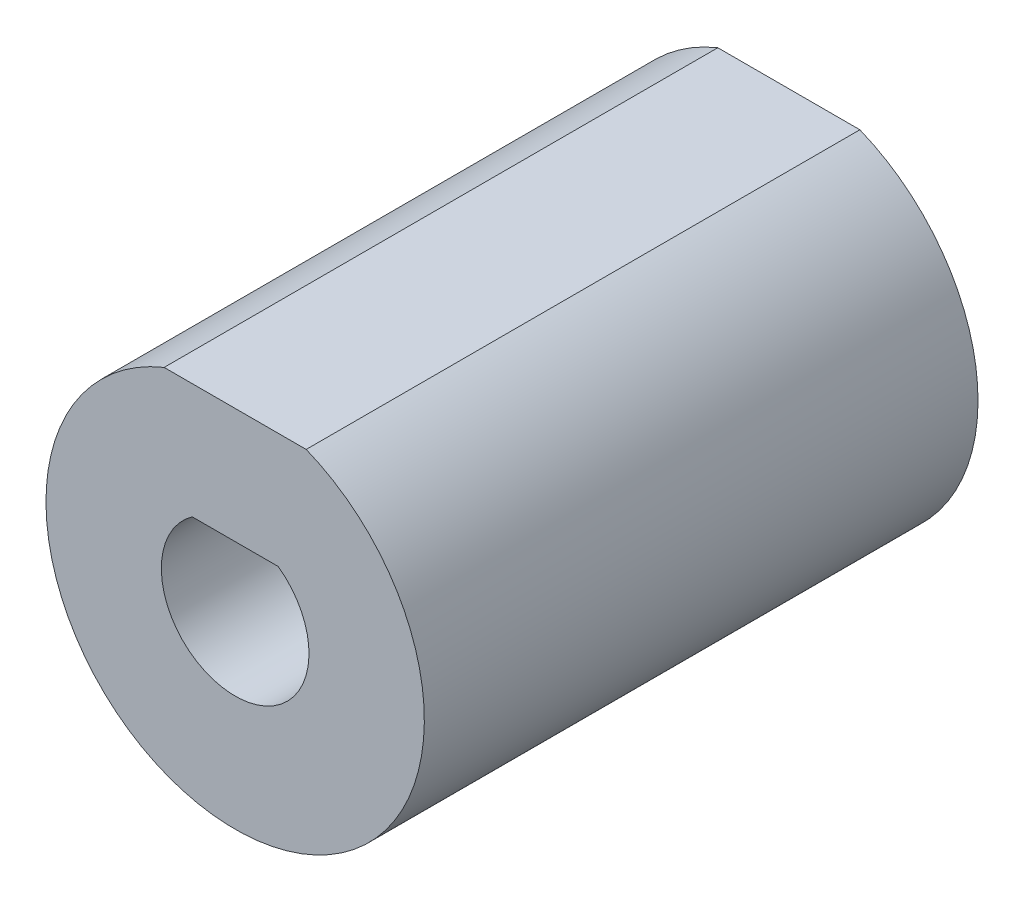
ISO-10303-21;
HEADER;
FILE_DESCRIPTION(('STEP AP214'),'2;1');
FILE_NAME('part.step','',(''),(''),'','','');
FILE_SCHEMA(('AUTOMOTIVE_DESIGN { 1 0 10303 214 1 1 1 1 }'));
ENDSEC;
DATA;
#1=APPLICATION_CONTEXT('core data for automotive mechanical design processes');
#2=APPLICATION_PROTOCOL_DEFINITION('international standard','automotive_design',2000,#1);
#3=PRODUCT_CONTEXT('',#1,'mechanical');
#4=PRODUCT('Part','Part','',(#3));
#5=PRODUCT_RELATED_PRODUCT_CATEGORY('part','',(#4));
#6=PRODUCT_DEFINITION_FORMATION('','',#4);
#7=PRODUCT_DEFINITION_CONTEXT('part definition',#1,'design');
#8=PRODUCT_DEFINITION('design','',#6,#7);
#9=PRODUCT_DEFINITION_SHAPE('','',#8);
#10=(LENGTH_UNIT() NAMED_UNIT(*) SI_UNIT(.MILLI.,.METRE.));
#11=(NAMED_UNIT(*) PLANE_ANGLE_UNIT() SI_UNIT($,.RADIAN.));
#12=(NAMED_UNIT(*) SI_UNIT($,.STERADIAN.) SOLID_ANGLE_UNIT());
#13=UNCERTAINTY_MEASURE_WITH_UNIT(LENGTH_MEASURE(1.E-05),#10,'distance_accuracy_value','');
#14=(GEOMETRIC_REPRESENTATION_CONTEXT(3) GLOBAL_UNCERTAINTY_ASSIGNED_CONTEXT((#13)) GLOBAL_UNIT_ASSIGNED_CONTEXT((#10,
#11,#12)) REPRESENTATION_CONTEXT('',''));
#15=CARTESIAN_POINT('',(0.,0.,0.));
#16=DIRECTION('',(0.,0.,1.));
#17=DIRECTION('',(1.,0.,0.));
#18=AXIS2_PLACEMENT_3D('',#15,#16,#17);
#19=CARTESIAN_POINT('',(0.,0.,6.35));
#20=DIRECTION('',(0.,0.,1.));
#21=DIRECTION('',(1.,0.,0.));
#22=AXIS2_PLACEMENT_3D('',#19,#20,#21);
#23=PLANE('',#22);
#24=CARTESIAN_POINT('',(0.,0.,6.35));
#25=DIRECTION('',(0.,0.,1.));
#26=DIRECTION('',(1.,0.,0.));
#27=AXIS2_PLACEMENT_3D('',#24,#25,#26);
#28=CIRCLE('',#27,5.207);
#29=CARTESIAN_POINT('',(-1.95514014842926,4.826,6.35));
#30=VERTEX_POINT('',#29);
#31=CARTESIAN_POINT('',(1.95514014842926,4.826,6.35));
#32=VERTEX_POINT('',#31);
#33=EDGE_CURVE('E79',#30,#32,#28,.T.);
#34=ORIENTED_EDGE('',*,*,#33,.T.);
#35=DIRECTION('',(-1.,0.,0.));
#36=VECTOR('',#35,1.);
#37=CARTESIAN_POINT('',(-1.95514014842926,4.826,6.35));
#38=LINE('',#37,#36);
#39=EDGE_CURVE('E55',#32,#30,#38,.T.);
#40=ORIENTED_EDGE('',*,*,#39,.T.);
#41=EDGE_LOOP('',(#34,#40));
#42=FACE_BOUND('',#41,.T.);
#43=DIRECTION('',(-1.,0.,0.));
#44=VECTOR('',#43,1.);
#45=CARTESIAN_POINT('',(-1.18457713974228,1.651,6.35));
#46=LINE('',#45,#44);
#47=CARTESIAN_POINT('',(1.18457713974228,1.651,6.35));
#48=VERTEX_POINT('',#47);
#49=CARTESIAN_POINT('',(-1.18457713974228,1.651,6.35));
#50=VERTEX_POINT('',#49);
#51=EDGE_CURVE('E97',#48,#50,#46,.T.);
#52=ORIENTED_EDGE('',*,*,#51,.F.);
#53=CARTESIAN_POINT('',(0.,0.,6.35));
#54=DIRECTION('',(0.,0.,1.));
#55=DIRECTION('',(1.,0.,0.));
#56=AXIS2_PLACEMENT_3D('',#53,#54,#55);
#57=CIRCLE('',#56,2.032);
#58=EDGE_CURVE('E95',#50,#48,#57,.T.);
#59=ORIENTED_EDGE('',*,*,#58,.F.);
#60=EDGE_LOOP('',(#52,#59));
#61=FACE_BOUND('',#60,.T.);
#62=ADVANCED_FACE('F33',(#42,#61),#23,.T.);
#63=CARTESIAN_POINT('',(0.,0.,6.35));
#64=DIRECTION('',(0.,0.,-1.));
#65=DIRECTION('',(-1.,0.,0.));
#66=AXIS2_PLACEMENT_3D('',#63,#64,#65);
#67=CYLINDRICAL_SURFACE('',#66,5.207);
#68=DIRECTION('',(0.,0.,-1.));
#69=VECTOR('',#68,1.);
#70=CARTESIAN_POINT('',(-1.95514014842926,4.826,6.35));
#71=LINE('',#70,#69);
#72=CARTESIAN_POINT('',(-1.95514014842926,4.826,-8.89));
#73=VERTEX_POINT('',#72);
#74=EDGE_CURVE('E74',#30,#73,#71,.T.);
#75=ORIENTED_EDGE('',*,*,#74,.T.);
#76=CARTESIAN_POINT('',(0.,0.,-8.89));
#77=DIRECTION('',(0.,0.,-1.));
#78=DIRECTION('',(-1.,0.,0.));
#79=AXIS2_PLACEMENT_3D('',#76,#77,#78);
#80=CIRCLE('',#79,5.207);
#81=CARTESIAN_POINT('',(1.95514014842926,4.826,-8.89));
#82=VERTEX_POINT('',#81);
#83=EDGE_CURVE('E78',#82,#73,#80,.T.);
#84=ORIENTED_EDGE('',*,*,#83,.F.);
#85=DIRECTION('',(0.,0.,-1.));
#86=VECTOR('',#85,1.);
#87=CARTESIAN_POINT('',(1.95514014842926,4.826,6.35));
#88=LINE('',#87,#86);
#89=EDGE_CURVE('E41',#32,#82,#88,.T.);
#90=ORIENTED_EDGE('',*,*,#89,.F.);
#91=ORIENTED_EDGE('',*,*,#33,.F.);
#92=EDGE_LOOP('',(#75,#84,#90,#91));
#93=FACE_BOUND('',#92,.T.);
#94=ADVANCED_FACE('F35',(#93),#67,.T.);
#95=CARTESIAN_POINT('',(-1.95514014842926,4.826,6.35));
#96=DIRECTION('',(0.,-1.,0.));
#97=DIRECTION('',(0.,0.,-1.));
#98=AXIS2_PLACEMENT_3D('',#95,#96,#97);
#99=PLANE('',#98);
#100=ORIENTED_EDGE('',*,*,#89,.T.);
#101=DIRECTION('',(1.,0.,0.));
#102=VECTOR('',#101,1.);
#103=CARTESIAN_POINT('',(-1.95514014842926,4.826,-8.89));
#104=LINE('',#103,#102);
#105=EDGE_CURVE('E83',#73,#82,#104,.T.);
#106=ORIENTED_EDGE('',*,*,#105,.F.);
#107=ORIENTED_EDGE('',*,*,#74,.F.);
#108=ORIENTED_EDGE('',*,*,#39,.F.);
#109=EDGE_LOOP('',(#100,#106,#107,#108));
#110=FACE_BOUND('',#109,.T.);
#111=ADVANCED_FACE('F84',(#110),#99,.F.);
#112=CARTESIAN_POINT('',(0.,0.,6.35));
#113=DIRECTION('',(0.,0.,-1.));
#114=DIRECTION('',(-1.,0.,0.));
#115=AXIS2_PLACEMENT_3D('',#112,#113,#114);
#116=CYLINDRICAL_SURFACE('',#115,2.032);
#117=CARTESIAN_POINT('',(0.,0.,0.));
#118=DIRECTION('',(0.,0.,1.));
#119=DIRECTION('',(1.,0.,0.));
#120=AXIS2_PLACEMENT_3D('',#117,#118,#119);
#121=CIRCLE('',#120,2.032);
#122=CARTESIAN_POINT('',(-1.18457713974228,1.651,0.));
#123=VERTEX_POINT('',#122);
#124=CARTESIAN_POINT('',(1.18457713974228,1.651,0.));
#125=VERTEX_POINT('',#124);
#126=EDGE_CURVE('E86',#123,#125,#121,.T.);
#127=ORIENTED_EDGE('',*,*,#126,.F.);
#128=DIRECTION('',(0.,0.,-1.));
#129=VECTOR('',#128,1.);
#130=CARTESIAN_POINT('',(-1.18457713974228,1.651,6.35));
#131=LINE('',#130,#129);
#132=EDGE_CURVE('E100',#50,#123,#131,.T.);
#133=ORIENTED_EDGE('',*,*,#132,.F.);
#134=ORIENTED_EDGE('',*,*,#58,.T.);
#135=DIRECTION('',(0.,0.,-1.));
#136=VECTOR('',#135,1.);
#137=CARTESIAN_POINT('',(1.18457713974228,1.651,6.35));
#138=LINE('',#137,#136);
#139=EDGE_CURVE('E48',#48,#125,#138,.T.);
#140=ORIENTED_EDGE('',*,*,#139,.T.);
#141=EDGE_LOOP('',(#127,#133,#134,#140));
#142=FACE_BOUND('',#141,.T.);
#143=ADVANCED_FACE('F117',(#142),#116,.F.);
#144=CARTESIAN_POINT('',(-1.18457713974228,1.651,6.35));
#145=DIRECTION('',(0.,-1.,0.));
#146=DIRECTION('',(0.,0.,-1.));
#147=AXIS2_PLACEMENT_3D('',#144,#145,#146);
#148=PLANE('',#147);
#149=DIRECTION('',(-1.,0.,0.));
#150=VECTOR('',#149,1.);
#151=CARTESIAN_POINT('',(-1.18457713974228,1.651,0.));
#152=LINE('',#151,#150);
#153=EDGE_CURVE('E98',#125,#123,#152,.T.);
#154=ORIENTED_EDGE('',*,*,#153,.F.);
#155=ORIENTED_EDGE('',*,*,#139,.F.);
#156=ORIENTED_EDGE('',*,*,#51,.T.);
#157=ORIENTED_EDGE('',*,*,#132,.T.);
#158=EDGE_LOOP('',(#154,#155,#156,#157));
#159=FACE_BOUND('',#158,.T.);
#160=ADVANCED_FACE('F114',(#159),#148,.T.);
#161=CARTESIAN_POINT('',(0.,0.,0.));
#162=DIRECTION('',(0.,0.,-1.));
#163=DIRECTION('',(-1.,0.,0.));
#164=AXIS2_PLACEMENT_3D('',#161,#162,#163);
#165=PLANE('',#164);
#166=ORIENTED_EDGE('',*,*,#153,.T.);
#167=ORIENTED_EDGE('',*,*,#126,.T.);
#168=EDGE_LOOP('',(#166,#167));
#169=FACE_BOUND('',#168,.T.);
#170=ADVANCED_FACE('F119',(#169),#165,.F.);
#171=CARTESIAN_POINT('',(0.,0.,-8.89));
#172=DIRECTION('',(0.,0.,-1.));
#173=DIRECTION('',(-1.,0.,0.));
#174=AXIS2_PLACEMENT_3D('',#171,#172,#173);
#175=PLANE('',#174);
#176=ORIENTED_EDGE('',*,*,#83,.T.);
#177=ORIENTED_EDGE('',*,*,#105,.T.);
#178=EDGE_LOOP('',(#176,#177));
#179=FACE_BOUND('',#178,.T.);
#180=CARTESIAN_POINT('',(0.,0.,-8.89));
#181=DIRECTION('',(0.,0.,-1.));
#182=DIRECTION('',(-1.,0.,0.));
#183=AXIS2_PLACEMENT_3D('',#180,#181,#182);
#184=CIRCLE('',#183,1.5875);
#185=CARTESIAN_POINT('',(-1.5875,0.,-8.89));
#186=VERTEX_POINT('',#185);
#187=EDGE_CURVE('E90',#186,#186,#184,.T.);
#188=ORIENTED_EDGE('',*,*,#187,.F.);
#189=EDGE_LOOP('',(#188));
#190=FACE_BOUND('',#189,.T.);
#191=ADVANCED_FACE('F88',(#179,#190),#175,.T.);
#192=CARTESIAN_POINT('',(0.,0.,-8.89));
#193=DIRECTION('',(0.,0.,1.));
#194=DIRECTION('',(1.,0.,0.));
#195=AXIS2_PLACEMENT_3D('',#192,#193,#194);
#196=CYLINDRICAL_SURFACE('',#195,1.5875);
#197=ORIENTED_EDGE('',*,*,#187,.T.);
#198=EDGE_LOOP('',(#197));
#199=FACE_BOUND('',#198,.T.);
#200=CARTESIAN_POINT('',(0.,0.,-2.54));
#201=DIRECTION('',(0.,0.,-1.));
#202=DIRECTION('',(-1.,0.,0.));
#203=AXIS2_PLACEMENT_3D('',#200,#201,#202);
#204=CIRCLE('',#203,1.5875);
#205=CARTESIAN_POINT('',(-1.5875,0.,-2.54));
#206=VERTEX_POINT('',#205);
#207=EDGE_CURVE('E11',#206,#206,#204,.F.);
#208=ORIENTED_EDGE('',*,*,#207,.T.);
#209=EDGE_LOOP('',(#208));
#210=FACE_BOUND('',#209,.T.);
#211=ADVANCED_FACE('F126',(#199,#210),#196,.F.);
#212=CARTESIAN_POINT('',(0.,0.,-2.54));
#213=DIRECTION('',(0.,0.,-1.));
#214=DIRECTION('',(-1.,0.,0.));
#215=AXIS2_PLACEMENT_3D('',#212,#213,#214);
#216=PLANE('',#215);
#217=ORIENTED_EDGE('',*,*,#207,.F.);
#218=EDGE_LOOP('',(#217));
#219=FACE_BOUND('',#218,.T.);
#220=ADVANCED_FACE('F130',(#219),#216,.T.);
#221=CLOSED_SHELL('',(#62,#94,#111,#143,#160,#170,#191,#211,#220));
#222=MANIFOLD_SOLID_BREP('B2',#221);
#223=ADVANCED_BREP_SHAPE_REPRESENTATION('',(#18,#222),#14);
#224=SHAPE_DEFINITION_REPRESENTATION(#9,#223);
ENDSEC;
END-ISO-10303-21;
